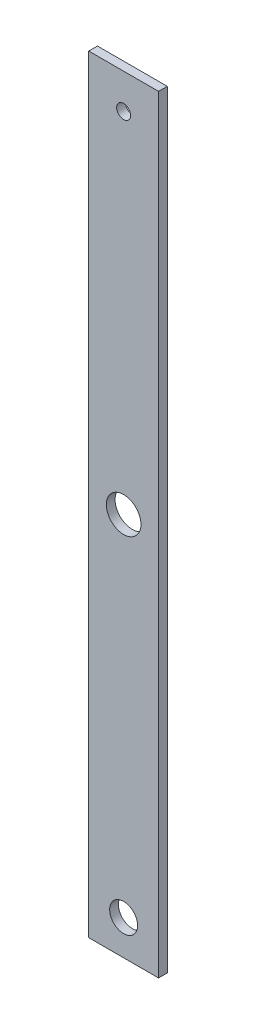
ISO-10303-21;
HEADER;
FILE_DESCRIPTION(('STEP AP214'),'2;1');
FILE_NAME('part.step','',(''),(''),'','','');
FILE_SCHEMA(('AUTOMOTIVE_DESIGN { 1 0 10303 214 1 1 1 1 }'));
ENDSEC;
DATA;
#1=APPLICATION_CONTEXT('core data for automotive mechanical design processes');
#2=APPLICATION_PROTOCOL_DEFINITION('international standard','automotive_design',2000,#1);
#3=PRODUCT_CONTEXT('',#1,'mechanical');
#4=PRODUCT('Part','Part','',(#3));
#5=PRODUCT_RELATED_PRODUCT_CATEGORY('part','',(#4));
#6=PRODUCT_DEFINITION_FORMATION('','',#4);
#7=PRODUCT_DEFINITION_CONTEXT('part definition',#1,'design');
#8=PRODUCT_DEFINITION('design','',#6,#7);
#9=PRODUCT_DEFINITION_SHAPE('','',#8);
#10=(LENGTH_UNIT() NAMED_UNIT(*) SI_UNIT(.MILLI.,.METRE.));
#11=(NAMED_UNIT(*) PLANE_ANGLE_UNIT() SI_UNIT($,.RADIAN.));
#12=(NAMED_UNIT(*) SI_UNIT($,.STERADIAN.) SOLID_ANGLE_UNIT());
#13=UNCERTAINTY_MEASURE_WITH_UNIT(LENGTH_MEASURE(1.E-05),#10,'distance_accuracy_value','');
#14=(GEOMETRIC_REPRESENTATION_CONTEXT(3) GLOBAL_UNCERTAINTY_ASSIGNED_CONTEXT((#13)) GLOBAL_UNIT_ASSIGNED_CONTEXT((#10,
#11,#12)) REPRESENTATION_CONTEXT('',''));
#15=CARTESIAN_POINT('',(0.,0.,0.));
#16=DIRECTION('',(0.,0.,1.));
#17=DIRECTION('',(1.,0.,0.));
#18=AXIS2_PLACEMENT_3D('',#15,#16,#17);
#19=CARTESIAN_POINT('',(6.35,-69.85,1.5875));
#20=DIRECTION('',(0.,0.,-1.));
#21=DIRECTION('',(-1.,0.,0.));
#22=AXIS2_PLACEMENT_3D('',#19,#20,#21);
#23=PLANE('',#22);
#24=CARTESIAN_POINT('',(0.,63.5,1.5875));
#25=DIRECTION('',(0.,0.,1.));
#26=DIRECTION('',(1.,0.,0.));
#27=AXIS2_PLACEMENT_3D('',#24,#25,#26);
#28=CIRCLE('',#27,1.27);
#29=CARTESIAN_POINT('',(1.27,63.5,1.5875));
#30=VERTEX_POINT('',#29);
#31=EDGE_CURVE('E115',#30,#30,#28,.T.);
#32=ORIENTED_EDGE('',*,*,#31,.F.);
#33=EDGE_LOOP('',(#32));
#34=FACE_BOUND('',#33,.T.);
#35=DIRECTION('',(1.,0.,0.));
#36=VECTOR('',#35,1.);
#37=CARTESIAN_POINT('',(-6.35,-69.85,1.5875));
#38=LINE('',#37,#36);
#39=CARTESIAN_POINT('',(-6.35,-69.85,1.5875));
#40=VERTEX_POINT('',#39);
#41=CARTESIAN_POINT('',(6.35,-69.85,1.5875));
#42=VERTEX_POINT('',#41);
#43=EDGE_CURVE('E85',#40,#42,#38,.T.);
#44=ORIENTED_EDGE('',*,*,#43,.T.);
#45=DIRECTION('',(0.,1.,0.));
#46=VECTOR('',#45,1.);
#47=CARTESIAN_POINT('',(6.35000000000001,69.85,1.5875));
#48=LINE('',#47,#46);
#49=CARTESIAN_POINT('',(6.35000000000001,69.85,1.5875));
#50=VERTEX_POINT('',#49);
#51=EDGE_CURVE('E80',#42,#50,#48,.T.);
#52=ORIENTED_EDGE('',*,*,#51,.T.);
#53=DIRECTION('',(-1.,0.,0.));
#54=VECTOR('',#53,1.);
#55=CARTESIAN_POINT('',(-6.35,69.85,1.5875));
#56=LINE('',#55,#54);
#57=CARTESIAN_POINT('',(-6.35,69.85,1.5875));
#58=VERTEX_POINT('',#57);
#59=EDGE_CURVE('E83',#50,#58,#56,.T.);
#60=ORIENTED_EDGE('',*,*,#59,.T.);
#61=DIRECTION('',(0.,-1.,0.));
#62=VECTOR('',#61,1.);
#63=CARTESIAN_POINT('',(-6.35,69.85,1.5875));
#64=LINE('',#63,#62);
#65=EDGE_CURVE('E50',#58,#40,#64,.T.);
#66=ORIENTED_EDGE('',*,*,#65,.T.);
#67=EDGE_LOOP('',(#44,#52,#60,#66));
#68=FACE_BOUND('',#67,.T.);
#69=CARTESIAN_POINT('',(0.,0.,1.5875));
#70=DIRECTION('',(0.,0.,1.));
#71=DIRECTION('',(1.,0.,0.));
#72=AXIS2_PLACEMENT_3D('',#69,#70,#71);
#73=CIRCLE('',#72,3.1496);
#74=CARTESIAN_POINT('',(3.1496,0.,1.5875));
#75=VERTEX_POINT('',#74);
#76=EDGE_CURVE('E100',#75,#75,#73,.T.);
#77=ORIENTED_EDGE('',*,*,#76,.F.);
#78=EDGE_LOOP('',(#77));
#79=FACE_BOUND('',#78,.T.);
#80=CARTESIAN_POINT('',(0.,-63.5,1.5875));
#81=DIRECTION('',(0.,0.,1.));
#82=DIRECTION('',(-1.,0.,0.));
#83=AXIS2_PLACEMENT_3D('',#80,#81,#82);
#84=CIRCLE('',#83,2.54);
#85=CARTESIAN_POINT('',(-2.54,-63.5,1.5875));
#86=VERTEX_POINT('',#85);
#87=EDGE_CURVE('E121',#86,#86,#84,.T.);
#88=ORIENTED_EDGE('',*,*,#87,.F.);
#89=EDGE_LOOP('',(#88));
#90=FACE_BOUND('',#89,.T.);
#91=ADVANCED_FACE('F33',(#34,#68,#79,#90),#23,.F.);
#92=CARTESIAN_POINT('',(6.35,-69.85,0.));
#93=DIRECTION('',(0.,0.,-1.));
#94=DIRECTION('',(-1.,0.,0.));
#95=AXIS2_PLACEMENT_3D('',#92,#93,#94);
#96=PLANE('',#95);
#97=CARTESIAN_POINT('',(0.,63.5,0.));
#98=DIRECTION('',(0.,0.,1.));
#99=DIRECTION('',(1.,0.,0.));
#100=AXIS2_PLACEMENT_3D('',#97,#98,#99);
#101=CIRCLE('',#100,1.27);
#102=CARTESIAN_POINT('',(1.27,63.5,0.));
#103=VERTEX_POINT('',#102);
#104=EDGE_CURVE('E118',#103,#103,#101,.T.);
#105=ORIENTED_EDGE('',*,*,#104,.T.);
#106=EDGE_LOOP('',(#105));
#107=FACE_BOUND('',#106,.T.);
#108=DIRECTION('',(1.,0.,0.));
#109=VECTOR('',#108,1.);
#110=CARTESIAN_POINT('',(-6.35,-69.85,0.));
#111=LINE('',#110,#109);
#112=CARTESIAN_POINT('',(-6.35,-69.85,0.));
#113=VERTEX_POINT('',#112);
#114=CARTESIAN_POINT('',(6.35,-69.85,0.));
#115=VERTEX_POINT('',#114);
#116=EDGE_CURVE('E97',#113,#115,#111,.T.);
#117=ORIENTED_EDGE('',*,*,#116,.F.);
#118=DIRECTION('',(0.,-1.,0.));
#119=VECTOR('',#118,1.);
#120=CARTESIAN_POINT('',(-6.35,69.85,0.));
#121=LINE('',#120,#119);
#122=CARTESIAN_POINT('',(-6.35,69.85,0.));
#123=VERTEX_POINT('',#122);
#124=EDGE_CURVE('E73',#123,#113,#121,.T.);
#125=ORIENTED_EDGE('',*,*,#124,.F.);
#126=DIRECTION('',(-1.,0.,0.));
#127=VECTOR('',#126,1.);
#128=CARTESIAN_POINT('',(-6.35,69.85,0.));
#129=LINE('',#128,#127);
#130=CARTESIAN_POINT('',(6.35000000000001,69.85,0.));
#131=VERTEX_POINT('',#130);
#132=EDGE_CURVE('E67',#131,#123,#129,.T.);
#133=ORIENTED_EDGE('',*,*,#132,.F.);
#134=DIRECTION('',(0.,1.,0.));
#135=VECTOR('',#134,1.);
#136=CARTESIAN_POINT('',(6.35000000000001,69.85,0.));
#137=LINE('',#136,#135);
#138=EDGE_CURVE('E89',#115,#131,#137,.T.);
#139=ORIENTED_EDGE('',*,*,#138,.F.);
#140=EDGE_LOOP('',(#117,#125,#133,#139));
#141=FACE_BOUND('',#140,.T.);
#142=CARTESIAN_POINT('',(0.,0.,0.));
#143=DIRECTION('',(0.,0.,1.));
#144=DIRECTION('',(1.,0.,0.));
#145=AXIS2_PLACEMENT_3D('',#142,#143,#144);
#146=CIRCLE('',#145,3.1496);
#147=CARTESIAN_POINT('',(3.1496,0.,0.));
#148=VERTEX_POINT('',#147);
#149=EDGE_CURVE('E112',#148,#148,#146,.T.);
#150=ORIENTED_EDGE('',*,*,#149,.T.);
#151=EDGE_LOOP('',(#150));
#152=FACE_BOUND('',#151,.T.);
#153=CARTESIAN_POINT('',(0.,-63.5,0.));
#154=DIRECTION('',(0.,0.,1.));
#155=DIRECTION('',(-1.,0.,0.));
#156=AXIS2_PLACEMENT_3D('',#153,#154,#155);
#157=CIRCLE('',#156,2.54);
#158=CARTESIAN_POINT('',(-2.54,-63.5,0.));
#159=VERTEX_POINT('',#158);
#160=EDGE_CURVE('E124',#159,#159,#157,.T.);
#161=ORIENTED_EDGE('',*,*,#160,.T.);
#162=EDGE_LOOP('',(#161));
#163=FACE_BOUND('',#162,.T.);
#164=ADVANCED_FACE('F108',(#107,#141,#152,#163),#96,.T.);
#165=CARTESIAN_POINT('',(-6.35,-69.85,1.5875));
#166=DIRECTION('',(0.,1.,0.));
#167=DIRECTION('',(0.,0.,1.));
#168=AXIS2_PLACEMENT_3D('',#165,#166,#167);
#169=PLANE('',#168);
#170=ORIENTED_EDGE('',*,*,#116,.T.);
#171=DIRECTION('',(0.,0.,-1.));
#172=VECTOR('',#171,1.);
#173=CARTESIAN_POINT('',(6.35,-69.85,1.5875));
#174=LINE('',#173,#172);
#175=EDGE_CURVE('E11',#42,#115,#174,.T.);
#176=ORIENTED_EDGE('',*,*,#175,.F.);
#177=ORIENTED_EDGE('',*,*,#43,.F.);
#178=DIRECTION('',(0.,0.,-1.));
#179=VECTOR('',#178,1.);
#180=CARTESIAN_POINT('',(-6.35,-69.85,1.5875));
#181=LINE('',#180,#179);
#182=EDGE_CURVE('E93',#40,#113,#181,.T.);
#183=ORIENTED_EDGE('',*,*,#182,.T.);
#184=EDGE_LOOP('',(#170,#176,#177,#183));
#185=FACE_BOUND('',#184,.T.);
#186=ADVANCED_FACE('F35',(#185),#169,.F.);
#187=CARTESIAN_POINT('',(6.35000000000001,69.85,1.5875));
#188=DIRECTION('',(-1.,0.,0.));
#189=DIRECTION('',(0.,-1.,0.));
#190=AXIS2_PLACEMENT_3D('',#187,#188,#189);
#191=PLANE('',#190);
#192=ORIENTED_EDGE('',*,*,#138,.T.);
#193=DIRECTION('',(0.,0.,-1.));
#194=VECTOR('',#193,1.);
#195=CARTESIAN_POINT('',(6.35000000000001,69.85,1.5875));
#196=LINE('',#195,#194);
#197=EDGE_CURVE('E42',#50,#131,#196,.T.);
#198=ORIENTED_EDGE('',*,*,#197,.F.);
#199=ORIENTED_EDGE('',*,*,#51,.F.);
#200=ORIENTED_EDGE('',*,*,#175,.T.);
#201=EDGE_LOOP('',(#192,#198,#199,#200));
#202=FACE_BOUND('',#201,.T.);
#203=ADVANCED_FACE('F88',(#202),#191,.F.);
#204=CARTESIAN_POINT('',(-6.35,69.85,1.5875));
#205=DIRECTION('',(0.,-1.,0.));
#206=DIRECTION('',(0.,0.,-1.));
#207=AXIS2_PLACEMENT_3D('',#204,#205,#206);
#208=PLANE('',#207);
#209=ORIENTED_EDGE('',*,*,#132,.T.);
#210=DIRECTION('',(0.,0.,-1.));
#211=VECTOR('',#210,1.);
#212=CARTESIAN_POINT('',(-6.35,69.85,1.5875));
#213=LINE('',#212,#211);
#214=EDGE_CURVE('E90',#58,#123,#213,.T.);
#215=ORIENTED_EDGE('',*,*,#214,.F.);
#216=ORIENTED_EDGE('',*,*,#59,.F.);
#217=ORIENTED_EDGE('',*,*,#197,.T.);
#218=EDGE_LOOP('',(#209,#215,#216,#217));
#219=FACE_BOUND('',#218,.T.);
#220=ADVANCED_FACE('F91',(#219),#208,.F.);
#221=CARTESIAN_POINT('',(-6.35,69.85,1.5875));
#222=DIRECTION('',(1.,0.,0.));
#223=DIRECTION('',(0.,1.,0.));
#224=AXIS2_PLACEMENT_3D('',#221,#222,#223);
#225=PLANE('',#224);
#226=ORIENTED_EDGE('',*,*,#124,.T.);
#227=ORIENTED_EDGE('',*,*,#182,.F.);
#228=ORIENTED_EDGE('',*,*,#65,.F.);
#229=ORIENTED_EDGE('',*,*,#214,.T.);
#230=EDGE_LOOP('',(#226,#227,#228,#229));
#231=FACE_BOUND('',#230,.T.);
#232=ADVANCED_FACE('F105',(#231),#225,.F.);
#233=CARTESIAN_POINT('',(0.,0.,1.5875));
#234=DIRECTION('',(0.,0.,-1.));
#235=DIRECTION('',(-1.,0.,0.));
#236=AXIS2_PLACEMENT_3D('',#233,#234,#235);
#237=CYLINDRICAL_SURFACE('',#236,3.1496);
#238=ORIENTED_EDGE('',*,*,#76,.T.);
#239=EDGE_LOOP('',(#238));
#240=FACE_BOUND('',#239,.T.);
#241=ORIENTED_EDGE('',*,*,#149,.F.);
#242=EDGE_LOOP('',(#241));
#243=FACE_BOUND('',#242,.T.);
#244=ADVANCED_FACE('F143',(#240,#243),#237,.F.);
#245=CARTESIAN_POINT('',(0.,63.5,1.5875));
#246=DIRECTION('',(0.,0.,-1.));
#247=DIRECTION('',(-1.,0.,0.));
#248=AXIS2_PLACEMENT_3D('',#245,#246,#247);
#249=CYLINDRICAL_SURFACE('',#248,1.27);
#250=ORIENTED_EDGE('',*,*,#31,.T.);
#251=EDGE_LOOP('',(#250));
#252=FACE_BOUND('',#251,.T.);
#253=ORIENTED_EDGE('',*,*,#104,.F.);
#254=EDGE_LOOP('',(#253));
#255=FACE_BOUND('',#254,.T.);
#256=ADVANCED_FACE('F189',(#252,#255),#249,.F.);
#257=CARTESIAN_POINT('',(0.,-63.5,1.5875));
#258=DIRECTION('',(0.,0.,-1.));
#259=DIRECTION('',(-1.,0.,0.));
#260=AXIS2_PLACEMENT_3D('',#257,#258,#259);
#261=CYLINDRICAL_SURFACE('',#260,2.54);
#262=ORIENTED_EDGE('',*,*,#87,.T.);
#263=EDGE_LOOP('',(#262));
#264=FACE_BOUND('',#263,.T.);
#265=ORIENTED_EDGE('',*,*,#160,.F.);
#266=EDGE_LOOP('',(#265));
#267=FACE_BOUND('',#266,.T.);
#268=ADVANCED_FACE('F130',(#264,#267),#261,.F.);
#269=CLOSED_SHELL('',(#91,#164,#186,#203,#220,#232,#244,#256,#268));
#270=MANIFOLD_SOLID_BREP('B2',#269);
#271=ADVANCED_BREP_SHAPE_REPRESENTATION('',(#18,#270),#14);
#272=SHAPE_DEFINITION_REPRESENTATION(#9,#271);
ENDSEC;
END-ISO-10303-21;
